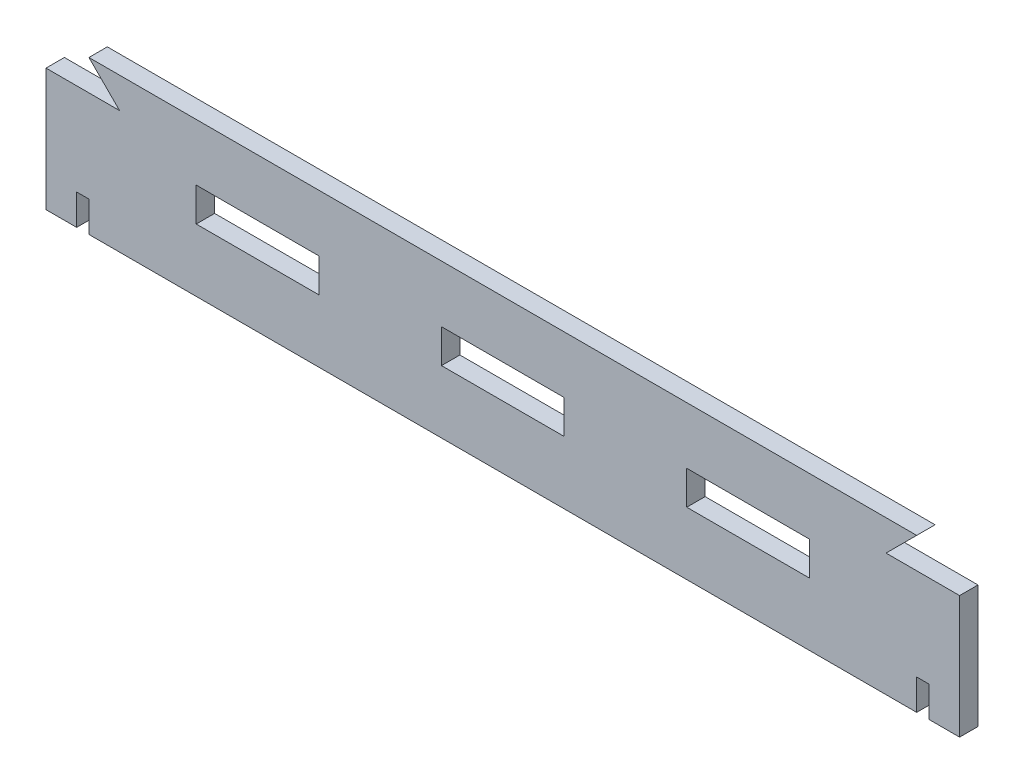
ISO-10303-21;
HEADER;
FILE_DESCRIPTION(('STEP AP214'),'2;1');
FILE_NAME('part.step','',(''),(''),'','','');
FILE_SCHEMA(('AUTOMOTIVE_DESIGN { 1 0 10303 214 1 1 1 1 }'));
ENDSEC;
DATA;
#1=APPLICATION_CONTEXT('core data for automotive mechanical design processes');
#2=APPLICATION_PROTOCOL_DEFINITION('international standard','automotive_design',2000,#1);
#3=PRODUCT_CONTEXT('',#1,'mechanical');
#4=PRODUCT('Part','Part','',(#3));
#5=PRODUCT_RELATED_PRODUCT_CATEGORY('part','',(#4));
#6=PRODUCT_DEFINITION_FORMATION('','',#4);
#7=PRODUCT_DEFINITION_CONTEXT('part definition',#1,'design');
#8=PRODUCT_DEFINITION('design','',#6,#7);
#9=PRODUCT_DEFINITION_SHAPE('','',#8);
#10=(LENGTH_UNIT() NAMED_UNIT(*) SI_UNIT(.MILLI.,.METRE.));
#11=(NAMED_UNIT(*) PLANE_ANGLE_UNIT() SI_UNIT($,.RADIAN.));
#12=(NAMED_UNIT(*) SI_UNIT($,.STERADIAN.) SOLID_ANGLE_UNIT());
#13=UNCERTAINTY_MEASURE_WITH_UNIT(LENGTH_MEASURE(1.E-05),#10,'distance_accuracy_value','');
#14=(GEOMETRIC_REPRESENTATION_CONTEXT(3) GLOBAL_UNCERTAINTY_ASSIGNED_CONTEXT((#13)) GLOBAL_UNIT_ASSIGNED_CONTEXT((#10,
#11,#12)) REPRESENTATION_CONTEXT('',''));
#15=CARTESIAN_POINT('',(0.,0.,0.));
#16=DIRECTION('',(0.,0.,1.));
#17=DIRECTION('',(1.,0.,0.));
#18=AXIS2_PLACEMENT_3D('',#15,#16,#17);
#19=CARTESIAN_POINT('',(61.5,30.,3.));
#20=DIRECTION('',(0.,-1.,0.));
#21=DIRECTION('',(1.,0.,0.));
#22=AXIS2_PLACEMENT_3D('',#19,#20,#21);
#23=PLANE('',#22);
#24=DIRECTION('',(-1.,0.,0.));
#25=VECTOR('',#24,1.);
#26=CARTESIAN_POINT('',(61.5,30.,0.));
#27=LINE('',#26,#25);
#28=CARTESIAN_POINT('',(61.5,30.,0.));
#29=VERTEX_POINT('',#28);
#30=CARTESIAN_POINT('',(-73.5,30.,0.));
#31=VERTEX_POINT('',#30);
#32=EDGE_CURVE('E442',#29,#31,#27,.T.);
#33=ORIENTED_EDGE('',*,*,#32,.T.);
#34=DIRECTION('',(0.,0.,-1.));
#35=VECTOR('',#34,1.);
#36=CARTESIAN_POINT('',(-73.5,30.,3.));
#37=LINE('',#36,#35);
#38=CARTESIAN_POINT('',(-73.5,30.,3.));
#39=VERTEX_POINT('',#38);
#40=EDGE_CURVE('E11',#39,#31,#37,.T.);
#41=ORIENTED_EDGE('',*,*,#40,.F.);
#42=DIRECTION('',(-1.,0.,0.));
#43=VECTOR('',#42,1.);
#44=CARTESIAN_POINT('',(61.5,30.,3.));
#45=LINE('',#44,#43);
#46=CARTESIAN_POINT('',(61.5,30.,3.));
#47=VERTEX_POINT('',#46);
#48=EDGE_CURVE('E452',#47,#39,#45,.T.);
#49=ORIENTED_EDGE('',*,*,#48,.F.);
#50=DIRECTION('',(0.,0.,-1.));
#51=VECTOR('',#50,1.);
#52=CARTESIAN_POINT('',(61.5,30.,3.));
#53=LINE('',#52,#51);
#54=EDGE_CURVE('E485',#47,#29,#53,.T.);
#55=ORIENTED_EDGE('',*,*,#54,.T.);
#56=EDGE_LOOP('',(#33,#41,#49,#55));
#57=FACE_BOUND('',#56,.T.);
#58=ADVANCED_FACE('F45',(#57),#23,.F.);
#59=CARTESIAN_POINT('',(-68.5,25.,3.));
#60=DIRECTION('',(0.707106781186544,0.707106781186551,0.));
#61=DIRECTION('',(-0.707106781186551,0.707106781186544,0.));
#62=AXIS2_PLACEMENT_3D('',#59,#60,#61);
#63=PLANE('',#62);
#64=DIRECTION('',(0.707106781186551,-0.707106781186544,0.));
#65=VECTOR('',#64,1.);
#66=CARTESIAN_POINT('',(-68.5,25.,0.));
#67=LINE('',#66,#65);
#68=CARTESIAN_POINT('',(-68.5,25.,0.));
#69=VERTEX_POINT('',#68);
#70=EDGE_CURVE('E243',#31,#69,#67,.T.);
#71=ORIENTED_EDGE('',*,*,#70,.T.);
#72=DIRECTION('',(0.,0.,-1.));
#73=VECTOR('',#72,1.);
#74=CARTESIAN_POINT('',(-68.5,25.,3.));
#75=LINE('',#74,#73);
#76=CARTESIAN_POINT('',(-68.5,25.,3.));
#77=VERTEX_POINT('',#76);
#78=EDGE_CURVE('E53',#77,#69,#75,.T.);
#79=ORIENTED_EDGE('',*,*,#78,.F.);
#80=DIRECTION('',(0.707106781186551,-0.707106781186544,0.));
#81=VECTOR('',#80,1.);
#82=CARTESIAN_POINT('',(-68.5,25.,3.));
#83=LINE('',#82,#81);
#84=EDGE_CURVE('E456',#39,#77,#83,.T.);
#85=ORIENTED_EDGE('',*,*,#84,.F.);
#86=ORIENTED_EDGE('',*,*,#40,.T.);
#87=EDGE_LOOP('',(#71,#79,#85,#86));
#88=FACE_BOUND('',#87,.T.);
#89=ADVANCED_FACE('F565',(#88),#63,.F.);
#90=CARTESIAN_POINT('',(-78.5,25.,3.));
#91=DIRECTION('',(0.,-1.,0.));
#92=DIRECTION('',(0.,0.,-1.));
#93=AXIS2_PLACEMENT_3D('',#90,#91,#92);
#94=PLANE('',#93);
#95=DIRECTION('',(-1.,0.,0.));
#96=VECTOR('',#95,1.);
#97=CARTESIAN_POINT('',(-78.5,25.,0.));
#98=LINE('',#97,#96);
#99=CARTESIAN_POINT('',(-80.5,25.,0.));
#100=VERTEX_POINT('',#99);
#101=EDGE_CURVE('E232',#69,#100,#98,.T.);
#102=ORIENTED_EDGE('',*,*,#101,.T.);
#103=DIRECTION('',(0.,0.,1.));
#104=VECTOR('',#103,1.);
#105=CARTESIAN_POINT('',(-80.5,25.,0.));
#106=LINE('',#105,#104);
#107=CARTESIAN_POINT('',(-80.5,25.,3.));
#108=VERTEX_POINT('',#107);
#109=EDGE_CURVE('E236',#100,#108,#106,.T.);
#110=ORIENTED_EDGE('',*,*,#109,.T.);
#111=DIRECTION('',(-1.,0.,0.));
#112=VECTOR('',#111,1.);
#113=CARTESIAN_POINT('',(-78.5,25.,3.));
#114=LINE('',#113,#112);
#115=EDGE_CURVE('E460',#77,#108,#114,.T.);
#116=ORIENTED_EDGE('',*,*,#115,.F.);
#117=ORIENTED_EDGE('',*,*,#78,.T.);
#118=EDGE_LOOP('',(#102,#110,#116,#117));
#119=FACE_BOUND('',#118,.T.);
#120=ADVANCED_FACE('F234',(#119),#94,.F.);
#121=CARTESIAN_POINT('',(-78.5,10.,3.));
#122=DIRECTION('',(0.,1.,0.));
#123=DIRECTION('',(0.,0.,1.));
#124=AXIS2_PLACEMENT_3D('',#121,#122,#123);
#125=PLANE('',#124);
#126=DIRECTION('',(1.,0.,0.));
#127=VECTOR('',#126,1.);
#128=CARTESIAN_POINT('',(-78.5,10.,3.));
#129=LINE('',#128,#127);
#130=CARTESIAN_POINT('',(-75.5,10.,3.));
#131=VERTEX_POINT('',#130);
#132=CARTESIAN_POINT('',(-73.5,10.,3.));
#133=VERTEX_POINT('',#132);
#134=EDGE_CURVE('E463',#131,#133,#129,.T.);
#135=ORIENTED_EDGE('',*,*,#134,.F.);
#136=DIRECTION('',(0.,0.,-1.));
#137=VECTOR('',#136,1.);
#138=CARTESIAN_POINT('',(-75.5,10.,3.));
#139=LINE('',#138,#137);
#140=CARTESIAN_POINT('',(-75.5,10.,0.));
#141=VERTEX_POINT('',#140);
#142=EDGE_CURVE('E317',#131,#141,#139,.T.);
#143=ORIENTED_EDGE('',*,*,#142,.T.);
#144=DIRECTION('',(1.,0.,0.));
#145=VECTOR('',#144,1.);
#146=CARTESIAN_POINT('',(-78.5,10.,0.));
#147=LINE('',#146,#145);
#148=CARTESIAN_POINT('',(-73.5,10.,0.));
#149=VERTEX_POINT('',#148);
#150=EDGE_CURVE('E242',#141,#149,#147,.T.);
#151=ORIENTED_EDGE('',*,*,#150,.T.);
#152=DIRECTION('',(0.,0.,-1.));
#153=VECTOR('',#152,1.);
#154=CARTESIAN_POINT('',(-73.5,10.,3.));
#155=LINE('',#154,#153);
#156=EDGE_CURVE('E530',#133,#149,#155,.T.);
#157=ORIENTED_EDGE('',*,*,#156,.F.);
#158=EDGE_LOOP('',(#135,#143,#151,#157));
#159=FACE_BOUND('',#158,.T.);
#160=ADVANCED_FACE('F556',(#159),#125,.F.);
#161=CARTESIAN_POINT('',(-73.5,10.,3.));
#162=DIRECTION('',(1.,0.,0.));
#163=DIRECTION('',(0.,0.,-1.));
#164=AXIS2_PLACEMENT_3D('',#161,#162,#163);
#165=PLANE('',#164);
#166=DIRECTION('',(0.,-1.,0.));
#167=VECTOR('',#166,1.);
#168=CARTESIAN_POINT('',(-73.5,10.,0.));
#169=LINE('',#168,#167);
#170=CARTESIAN_POINT('',(-73.5,5.,0.));
#171=VERTEX_POINT('',#170);
#172=EDGE_CURVE('E493',#149,#171,#169,.T.);
#173=ORIENTED_EDGE('',*,*,#172,.T.);
#174=DIRECTION('',(0.,0.,-1.));
#175=VECTOR('',#174,1.);
#176=CARTESIAN_POINT('',(-73.5,5.,3.));
#177=LINE('',#176,#175);
#178=CARTESIAN_POINT('',(-73.5,5.,3.));
#179=VERTEX_POINT('',#178);
#180=EDGE_CURVE('E526',#179,#171,#177,.T.);
#181=ORIENTED_EDGE('',*,*,#180,.F.);
#182=DIRECTION('',(0.,-1.,0.));
#183=VECTOR('',#182,1.);
#184=CARTESIAN_POINT('',(-73.5,10.,3.));
#185=LINE('',#184,#183);
#186=EDGE_CURVE('E466',#133,#179,#185,.T.);
#187=ORIENTED_EDGE('',*,*,#186,.F.);
#188=ORIENTED_EDGE('',*,*,#156,.T.);
#189=EDGE_LOOP('',(#173,#181,#187,#188));
#190=FACE_BOUND('',#189,.T.);
#191=ADVANCED_FACE('F538',(#190),#165,.F.);
#192=CARTESIAN_POINT('',(-73.5,5.,3.));
#193=DIRECTION('',(0.,1.,0.));
#194=DIRECTION('',(0.,0.,1.));
#195=AXIS2_PLACEMENT_3D('',#192,#193,#194);
#196=PLANE('',#195);
#197=DIRECTION('',(1.,0.,0.));
#198=VECTOR('',#197,1.);
#199=CARTESIAN_POINT('',(-73.5,5.,0.));
#200=LINE('',#199,#198);
#201=CARTESIAN_POINT('',(61.5,5.,0.));
#202=VERTEX_POINT('',#201);
#203=EDGE_CURVE('E496',#171,#202,#200,.T.);
#204=ORIENTED_EDGE('',*,*,#203,.T.);
#205=DIRECTION('',(0.,0.,-1.));
#206=VECTOR('',#205,1.);
#207=CARTESIAN_POINT('',(61.5,5.,3.));
#208=LINE('',#207,#206);
#209=CARTESIAN_POINT('',(61.5,5.,3.));
#210=VERTEX_POINT('',#209);
#211=EDGE_CURVE('E522',#210,#202,#208,.T.);
#212=ORIENTED_EDGE('',*,*,#211,.F.);
#213=DIRECTION('',(1.,0.,0.));
#214=VECTOR('',#213,1.);
#215=CARTESIAN_POINT('',(-73.5,5.,3.));
#216=LINE('',#215,#214);
#217=EDGE_CURVE('E469',#179,#210,#216,.T.);
#218=ORIENTED_EDGE('',*,*,#217,.F.);
#219=ORIENTED_EDGE('',*,*,#180,.T.);
#220=EDGE_LOOP('',(#204,#212,#218,#219));
#221=FACE_BOUND('',#220,.T.);
#222=ADVANCED_FACE('F547',(#221),#196,.F.);
#223=CARTESIAN_POINT('',(61.5,5.,3.));
#224=DIRECTION('',(-1.,0.,0.));
#225=DIRECTION('',(0.,0.,1.));
#226=AXIS2_PLACEMENT_3D('',#223,#224,#225);
#227=PLANE('',#226);
#228=DIRECTION('',(0.,1.,0.));
#229=VECTOR('',#228,1.);
#230=CARTESIAN_POINT('',(61.5,5.,0.));
#231=LINE('',#230,#229);
#232=CARTESIAN_POINT('',(61.5,10.,0.));
#233=VERTEX_POINT('',#232);
#234=EDGE_CURVE('E499',#202,#233,#231,.T.);
#235=ORIENTED_EDGE('',*,*,#234,.T.);
#236=DIRECTION('',(0.,0.,-1.));
#237=VECTOR('',#236,1.);
#238=CARTESIAN_POINT('',(61.5,10.,3.));
#239=LINE('',#238,#237);
#240=CARTESIAN_POINT('',(61.5,10.,3.));
#241=VERTEX_POINT('',#240);
#242=EDGE_CURVE('E518',#241,#233,#239,.T.);
#243=ORIENTED_EDGE('',*,*,#242,.F.);
#244=DIRECTION('',(0.,1.,0.));
#245=VECTOR('',#244,1.);
#246=CARTESIAN_POINT('',(61.5,5.,3.));
#247=LINE('',#246,#245);
#248=EDGE_CURVE('E472',#210,#241,#247,.T.);
#249=ORIENTED_EDGE('',*,*,#248,.F.);
#250=ORIENTED_EDGE('',*,*,#211,.T.);
#251=EDGE_LOOP('',(#235,#243,#249,#250));
#252=FACE_BOUND('',#251,.T.);
#253=ADVANCED_FACE('F551',(#252),#227,.F.);
#254=CARTESIAN_POINT('',(61.5,10.,3.));
#255=DIRECTION('',(0.,1.,0.));
#256=DIRECTION('',(0.,0.,1.));
#257=AXIS2_PLACEMENT_3D('',#254,#255,#256);
#258=PLANE('',#257);
#259=DIRECTION('',(1.,0.,0.));
#260=VECTOR('',#259,1.);
#261=CARTESIAN_POINT('',(61.5,10.,0.));
#262=LINE('',#261,#260);
#263=CARTESIAN_POINT('',(63.5,10.,0.));
#264=VERTEX_POINT('',#263);
#265=EDGE_CURVE('E502',#233,#264,#262,.T.);
#266=ORIENTED_EDGE('',*,*,#265,.T.);
#267=DIRECTION('',(0.,0.,1.));
#268=VECTOR('',#267,1.);
#269=CARTESIAN_POINT('',(63.5,10.,3.));
#270=LINE('',#269,#268);
#271=CARTESIAN_POINT('',(63.5,10.,3.));
#272=VERTEX_POINT('',#271);
#273=EDGE_CURVE('E279',#264,#272,#270,.T.);
#274=ORIENTED_EDGE('',*,*,#273,.T.);
#275=DIRECTION('',(1.,0.,0.));
#276=VECTOR('',#275,1.);
#277=CARTESIAN_POINT('',(61.5,10.,3.));
#278=LINE('',#277,#276);
#279=EDGE_CURVE('E475',#241,#272,#278,.T.);
#280=ORIENTED_EDGE('',*,*,#279,.F.);
#281=ORIENTED_EDGE('',*,*,#242,.T.);
#282=EDGE_LOOP('',(#266,#274,#280,#281));
#283=FACE_BOUND('',#282,.T.);
#284=ADVANCED_FACE('F589',(#283),#258,.F.);
#285=CARTESIAN_POINT('',(56.5,25.,3.));
#286=DIRECTION('',(0.,-1.,0.));
#287=DIRECTION('',(0.,0.,-1.));
#288=AXIS2_PLACEMENT_3D('',#285,#286,#287);
#289=PLANE('',#288);
#290=DIRECTION('',(0.,0.,-1.));
#291=VECTOR('',#290,1.);
#292=CARTESIAN_POINT('',(56.5,25.,3.));
#293=LINE('',#292,#291);
#294=CARTESIAN_POINT('',(56.5,25.,3.));
#295=VERTEX_POINT('',#294);
#296=CARTESIAN_POINT('',(56.5,25.,0.));
#297=VERTEX_POINT('',#296);
#298=EDGE_CURVE('E514',#295,#297,#293,.T.);
#299=ORIENTED_EDGE('',*,*,#298,.F.);
#300=DIRECTION('',(-1.,0.,0.));
#301=VECTOR('',#300,1.);
#302=CARTESIAN_POINT('',(56.5,25.,3.));
#303=LINE('',#302,#301);
#304=CARTESIAN_POINT('',(68.5,25.,3.));
#305=VERTEX_POINT('',#304);
#306=EDGE_CURVE('E479',#305,#295,#303,.T.);
#307=ORIENTED_EDGE('',*,*,#306,.F.);
#308=DIRECTION('',(0.,0.,1.));
#309=VECTOR('',#308,1.);
#310=CARTESIAN_POINT('',(68.5,25.,0.));
#311=LINE('',#310,#309);
#312=CARTESIAN_POINT('',(68.5,25.,0.));
#313=VERTEX_POINT('',#312);
#314=EDGE_CURVE('E290',#313,#305,#311,.T.);
#315=ORIENTED_EDGE('',*,*,#314,.F.);
#316=DIRECTION('',(-1.,0.,0.));
#317=VECTOR('',#316,1.);
#318=CARTESIAN_POINT('',(56.5,25.,0.));
#319=LINE('',#318,#317);
#320=EDGE_CURVE('E506',#313,#297,#319,.T.);
#321=ORIENTED_EDGE('',*,*,#320,.T.);
#322=EDGE_LOOP('',(#299,#307,#315,#321));
#323=FACE_BOUND('',#322,.T.);
#324=ADVANCED_FACE('F575',(#323),#289,.F.);
#325=CARTESIAN_POINT('',(56.5,25.,3.));
#326=DIRECTION('',(-0.707106781186551,0.707106781186544,0.));
#327=DIRECTION('',(-0.707106781186544,-0.707106781186551,0.));
#328=AXIS2_PLACEMENT_3D('',#325,#326,#327);
#329=PLANE('',#328);
#330=DIRECTION('',(0.707106781186544,0.707106781186551,0.));
#331=VECTOR('',#330,1.);
#332=CARTESIAN_POINT('',(56.5,25.,0.));
#333=LINE('',#332,#331);
#334=EDGE_CURVE('E457',#297,#29,#333,.T.);
#335=ORIENTED_EDGE('',*,*,#334,.T.);
#336=ORIENTED_EDGE('',*,*,#54,.F.);
#337=DIRECTION('',(0.707106781186544,0.707106781186551,0.));
#338=VECTOR('',#337,1.);
#339=CARTESIAN_POINT('',(56.5,25.,3.));
#340=LINE('',#339,#338);
#341=EDGE_CURVE('E482',#295,#47,#340,.T.);
#342=ORIENTED_EDGE('',*,*,#341,.F.);
#343=ORIENTED_EDGE('',*,*,#298,.T.);
#344=EDGE_LOOP('',(#335,#336,#342,#343));
#345=FACE_BOUND('',#344,.T.);
#346=ADVANCED_FACE('F572',(#345),#329,.F.);
#347=CARTESIAN_POINT('',(0.,0.,3.));
#348=DIRECTION('',(0.,0.,1.));
#349=DIRECTION('',(1.,0.,0.));
#350=AXIS2_PLACEMENT_3D('',#347,#348,#349);
#351=PLANE('',#350);
#352=ORIENTED_EDGE('',*,*,#115,.T.);
#353=DIRECTION('',(0.,-1.,0.));
#354=VECTOR('',#353,1.);
#355=CARTESIAN_POINT('',(-80.5,25.,3.));
#356=LINE('',#355,#354);
#357=CARTESIAN_POINT('',(-80.5,5.,3.));
#358=VERTEX_POINT('',#357);
#359=EDGE_CURVE('E251',#108,#358,#356,.T.);
#360=ORIENTED_EDGE('',*,*,#359,.T.);
#361=DIRECTION('',(1.,0.,0.));
#362=VECTOR('',#361,1.);
#363=CARTESIAN_POINT('',(-75.5,5.,3.));
#364=LINE('',#363,#362);
#365=CARTESIAN_POINT('',(-75.5,5.,3.));
#366=VERTEX_POINT('',#365);
#367=EDGE_CURVE('E266',#358,#366,#364,.T.);
#368=ORIENTED_EDGE('',*,*,#367,.T.);
#369=DIRECTION('',(0.,1.,0.));
#370=VECTOR('',#369,1.);
#371=CARTESIAN_POINT('',(-75.5,25.,3.));
#372=LINE('',#371,#370);
#373=EDGE_CURVE('E60',#366,#131,#372,.T.);
#374=ORIENTED_EDGE('',*,*,#373,.T.);
#375=ORIENTED_EDGE('',*,*,#134,.T.);
#376=ORIENTED_EDGE('',*,*,#186,.T.);
#377=ORIENTED_EDGE('',*,*,#217,.T.);
#378=ORIENTED_EDGE('',*,*,#248,.T.);
#379=ORIENTED_EDGE('',*,*,#279,.T.);
#380=DIRECTION('',(0.,-1.,0.));
#381=VECTOR('',#380,1.);
#382=CARTESIAN_POINT('',(63.5,25.,3.));
#383=LINE('',#382,#381);
#384=CARTESIAN_POINT('',(63.5,5.,3.));
#385=VERTEX_POINT('',#384);
#386=EDGE_CURVE('E271',#272,#385,#383,.T.);
#387=ORIENTED_EDGE('',*,*,#386,.T.);
#388=DIRECTION('',(1.,0.,0.));
#389=VECTOR('',#388,1.);
#390=CARTESIAN_POINT('',(63.5,5.,3.));
#391=LINE('',#390,#389);
#392=CARTESIAN_POINT('',(68.5,5.,3.));
#393=VERTEX_POINT('',#392);
#394=EDGE_CURVE('E298',#385,#393,#391,.T.);
#395=ORIENTED_EDGE('',*,*,#394,.T.);
#396=DIRECTION('',(0.,1.,0.));
#397=VECTOR('',#396,1.);
#398=CARTESIAN_POINT('',(68.5,25.,3.));
#399=LINE('',#398,#397);
#400=EDGE_CURVE('E294',#393,#305,#399,.T.);
#401=ORIENTED_EDGE('',*,*,#400,.T.);
#402=ORIENTED_EDGE('',*,*,#306,.T.);
#403=ORIENTED_EDGE('',*,*,#341,.T.);
#404=ORIENTED_EDGE('',*,*,#48,.T.);
#405=ORIENTED_EDGE('',*,*,#84,.T.);
#406=EDGE_LOOP('',(#352,#360,#368,#374,#375,#376,#377,#378,#379,#387,#395,#401,#402,#403,#404,#405));
#407=FACE_BOUND('',#406,.T.);
#408=DIRECTION('',(0.,-1.,0.));
#409=VECTOR('',#408,1.);
#410=CARTESIAN_POINT('',(24.,20.725640354706,3.));
#411=LINE('',#410,#409);
#412=CARTESIAN_POINT('',(24.,20.725640354706,3.));
#413=VERTEX_POINT('',#412);
#414=CARTESIAN_POINT('',(24.,15.225640354706,3.));
#415=VERTEX_POINT('',#414);
#416=EDGE_CURVE('E68',#413,#415,#411,.T.);
#417=ORIENTED_EDGE('',*,*,#416,.F.);
#418=DIRECTION('',(-1.,0.,0.));
#419=VECTOR('',#418,1.);
#420=CARTESIAN_POINT('',(24.,20.725640354706,3.));
#421=LINE('',#420,#419);
#422=CARTESIAN_POINT('',(44.,20.725640354706,3.));
#423=VERTEX_POINT('',#422);
#424=EDGE_CURVE('E379',#423,#413,#421,.T.);
#425=ORIENTED_EDGE('',*,*,#424,.F.);
#426=DIRECTION('',(0.,1.,0.));
#427=VECTOR('',#426,1.);
#428=CARTESIAN_POINT('',(44.,20.725640354706,3.));
#429=LINE('',#428,#427);
#430=CARTESIAN_POINT('',(44.,15.225640354706,3.));
#431=VERTEX_POINT('',#430);
#432=EDGE_CURVE('E383',#431,#423,#429,.T.);
#433=ORIENTED_EDGE('',*,*,#432,.F.);
#434=DIRECTION('',(1.,0.,0.));
#435=VECTOR('',#434,1.);
#436=CARTESIAN_POINT('',(24.,15.225640354706,3.));
#437=LINE('',#436,#435);
#438=EDGE_CURVE('E388',#415,#431,#437,.T.);
#439=ORIENTED_EDGE('',*,*,#438,.F.);
#440=EDGE_LOOP('',(#417,#425,#433,#439));
#441=FACE_BOUND('',#440,.T.);
#442=DIRECTION('',(0.,-1.,0.));
#443=VECTOR('',#442,1.);
#444=CARTESIAN_POINT('',(-56.,15.225640354706,3.));
#445=LINE('',#444,#443);
#446=CARTESIAN_POINT('',(-56.,20.725640354706,3.));
#447=VERTEX_POINT('',#446);
#448=CARTESIAN_POINT('',(-56.,15.225640354706,3.));
#449=VERTEX_POINT('',#448);
#450=EDGE_CURVE('E349',#447,#449,#445,.T.);
#451=ORIENTED_EDGE('',*,*,#450,.F.);
#452=DIRECTION('',(-1.,0.,0.));
#453=VECTOR('',#452,1.);
#454=CARTESIAN_POINT('',(-56.,20.725640354706,3.));
#455=LINE('',#454,#453);
#456=CARTESIAN_POINT('',(-36.,20.725640354706,3.));
#457=VERTEX_POINT('',#456);
#458=EDGE_CURVE('E336',#457,#447,#455,.T.);
#459=ORIENTED_EDGE('',*,*,#458,.F.);
#460=DIRECTION('',(0.,1.,0.));
#461=VECTOR('',#460,1.);
#462=CARTESIAN_POINT('',(-36.,15.225640354706,3.));
#463=LINE('',#462,#461);
#464=CARTESIAN_POINT('',(-36.,15.225640354706,3.));
#465=VERTEX_POINT('',#464);
#466=EDGE_CURVE('E340',#465,#457,#463,.T.);
#467=ORIENTED_EDGE('',*,*,#466,.F.);
#468=DIRECTION('',(1.,0.,0.));
#469=VECTOR('',#468,1.);
#470=CARTESIAN_POINT('',(-56.,15.225640354706,3.));
#471=LINE('',#470,#469);
#472=EDGE_CURVE('E345',#449,#465,#471,.T.);
#473=ORIENTED_EDGE('',*,*,#472,.F.);
#474=EDGE_LOOP('',(#451,#459,#467,#473));
#475=FACE_BOUND('',#474,.T.);
#476=DIRECTION('',(0.,1.,0.));
#477=VECTOR('',#476,1.);
#478=CARTESIAN_POINT('',(3.99999999999998,15.225640354706,3.));
#479=LINE('',#478,#477);
#480=CARTESIAN_POINT('',(3.99999999999998,15.225640354706,3.));
#481=VERTEX_POINT('',#480);
#482=CARTESIAN_POINT('',(3.99999999999998,20.725640354706,3.));
#483=VERTEX_POINT('',#482);
#484=EDGE_CURVE('E352',#481,#483,#479,.T.);
#485=ORIENTED_EDGE('',*,*,#484,.F.);
#486=DIRECTION('',(1.,0.,0.));
#487=VECTOR('',#486,1.);
#488=CARTESIAN_POINT('',(-16.,15.225640354706,3.));
#489=LINE('',#488,#487);
#490=CARTESIAN_POINT('',(-16.,15.225640354706,3.));
#491=VERTEX_POINT('',#490);
#492=EDGE_CURVE('E413',#491,#481,#489,.T.);
#493=ORIENTED_EDGE('',*,*,#492,.F.);
#494=DIRECTION('',(0.,-1.,0.));
#495=VECTOR('',#494,1.);
#496=CARTESIAN_POINT('',(-16.,15.225640354706,3.));
#497=LINE('',#496,#495);
#498=CARTESIAN_POINT('',(-16.,20.725640354706,3.));
#499=VERTEX_POINT('',#498);
#500=EDGE_CURVE('E432',#499,#491,#497,.T.);
#501=ORIENTED_EDGE('',*,*,#500,.F.);
#502=DIRECTION('',(-1.,0.,0.));
#503=VECTOR('',#502,1.);
#504=CARTESIAN_POINT('',(-16.,20.725640354706,3.));
#505=LINE('',#504,#503);
#506=EDGE_CURVE('E428',#483,#499,#505,.T.);
#507=ORIENTED_EDGE('',*,*,#506,.F.);
#508=EDGE_LOOP('',(#485,#493,#501,#507));
#509=FACE_BOUND('',#508,.T.);
#510=ADVANCED_FACE('F554',(#407,#441,#475,#509),#351,.T.);
#511=CARTESIAN_POINT('',(0.,0.,0.));
#512=DIRECTION('',(0.,0.,1.));
#513=DIRECTION('',(1.,0.,0.));
#514=AXIS2_PLACEMENT_3D('',#511,#512,#513);
#515=PLANE('',#514);
#516=DIRECTION('',(-1.,0.,0.));
#517=VECTOR('',#516,1.);
#518=CARTESIAN_POINT('',(24.,20.725640354706,0.));
#519=LINE('',#518,#517);
#520=CARTESIAN_POINT('',(44.,20.725640354706,0.));
#521=VERTEX_POINT('',#520);
#522=CARTESIAN_POINT('',(24.,20.725640354706,0.));
#523=VERTEX_POINT('',#522);
#524=EDGE_CURVE('E370',#521,#523,#519,.T.);
#525=ORIENTED_EDGE('',*,*,#524,.T.);
#526=DIRECTION('',(0.,-1.,0.));
#527=VECTOR('',#526,1.);
#528=CARTESIAN_POINT('',(24.,20.725640354706,0.));
#529=LINE('',#528,#527);
#530=CARTESIAN_POINT('',(24.,15.225640354706,0.));
#531=VERTEX_POINT('',#530);
#532=EDGE_CURVE('E384',#523,#531,#529,.T.);
#533=ORIENTED_EDGE('',*,*,#532,.T.);
#534=DIRECTION('',(1.,0.,0.));
#535=VECTOR('',#534,1.);
#536=CARTESIAN_POINT('',(24.,15.225640354706,0.));
#537=LINE('',#536,#535);
#538=CARTESIAN_POINT('',(44.,15.225640354706,0.));
#539=VERTEX_POINT('',#538);
#540=EDGE_CURVE('E401',#531,#539,#537,.T.);
#541=ORIENTED_EDGE('',*,*,#540,.T.);
#542=DIRECTION('',(0.,1.,0.));
#543=VECTOR('',#542,1.);
#544=CARTESIAN_POINT('',(44.,20.725640354706,0.));
#545=LINE('',#544,#543);
#546=EDGE_CURVE('E397',#539,#521,#545,.T.);
#547=ORIENTED_EDGE('',*,*,#546,.T.);
#548=EDGE_LOOP('',(#525,#533,#541,#547));
#549=FACE_BOUND('',#548,.T.);
#550=DIRECTION('',(-1.,0.,0.));
#551=VECTOR('',#550,1.);
#552=CARTESIAN_POINT('',(-56.,20.725640354706,0.));
#553=LINE('',#552,#551);
#554=CARTESIAN_POINT('',(-36.,20.725640354706,0.));
#555=VERTEX_POINT('',#554);
#556=CARTESIAN_POINT('',(-56.,20.725640354706,0.));
#557=VERTEX_POINT('',#556);
#558=EDGE_CURVE('E326',#555,#557,#553,.T.);
#559=ORIENTED_EDGE('',*,*,#558,.T.);
#560=DIRECTION('',(0.,-1.,0.));
#561=VECTOR('',#560,1.);
#562=CARTESIAN_POINT('',(-56.,15.225640354706,0.));
#563=LINE('',#562,#561);
#564=CARTESIAN_POINT('',(-56.,15.225640354706,0.));
#565=VERTEX_POINT('',#564);
#566=EDGE_CURVE('E341',#557,#565,#563,.T.);
#567=ORIENTED_EDGE('',*,*,#566,.T.);
#568=DIRECTION('',(1.,0.,0.));
#569=VECTOR('',#568,1.);
#570=CARTESIAN_POINT('',(-56.,15.225640354706,0.));
#571=LINE('',#570,#569);
#572=CARTESIAN_POINT('',(-36.,15.225640354706,0.));
#573=VERTEX_POINT('',#572);
#574=EDGE_CURVE('E360',#565,#573,#571,.T.);
#575=ORIENTED_EDGE('',*,*,#574,.T.);
#576=DIRECTION('',(0.,1.,0.));
#577=VECTOR('',#576,1.);
#578=CARTESIAN_POINT('',(-36.,15.225640354706,0.));
#579=LINE('',#578,#577);
#580=EDGE_CURVE('E356',#573,#555,#579,.T.);
#581=ORIENTED_EDGE('',*,*,#580,.T.);
#582=EDGE_LOOP('',(#559,#567,#575,#581));
#583=FACE_BOUND('',#582,.T.);
#584=DIRECTION('',(1.,0.,0.));
#585=VECTOR('',#584,1.);
#586=CARTESIAN_POINT('',(-16.,15.225640354706,0.));
#587=LINE('',#586,#585);
#588=CARTESIAN_POINT('',(-16.,15.225640354706,0.));
#589=VERTEX_POINT('',#588);
#590=CARTESIAN_POINT('',(3.99999999999998,15.225640354706,0.));
#591=VERTEX_POINT('',#590);
#592=EDGE_CURVE('E421',#589,#591,#587,.T.);
#593=ORIENTED_EDGE('',*,*,#592,.T.);
#594=DIRECTION('',(0.,1.,0.));
#595=VECTOR('',#594,1.);
#596=CARTESIAN_POINT('',(3.99999999999998,15.225640354706,0.));
#597=LINE('',#596,#595);
#598=CARTESIAN_POINT('',(3.99999999999998,20.725640354706,0.));
#599=VERTEX_POINT('',#598);
#600=EDGE_CURVE('E408',#591,#599,#597,.T.);
#601=ORIENTED_EDGE('',*,*,#600,.T.);
#602=DIRECTION('',(-1.,0.,0.));
#603=VECTOR('',#602,1.);
#604=CARTESIAN_POINT('',(-16.,20.725640354706,0.));
#605=LINE('',#604,#603);
#606=CARTESIAN_POINT('',(-16.,20.725640354706,0.));
#607=VERTEX_POINT('',#606);
#608=EDGE_CURVE('E412',#599,#607,#605,.T.);
#609=ORIENTED_EDGE('',*,*,#608,.T.);
#610=DIRECTION('',(0.,-1.,0.));
#611=VECTOR('',#610,1.);
#612=CARTESIAN_POINT('',(-16.,15.225640354706,0.));
#613=LINE('',#612,#611);
#614=EDGE_CURVE('E417',#607,#589,#613,.T.);
#615=ORIENTED_EDGE('',*,*,#614,.T.);
#616=EDGE_LOOP('',(#593,#601,#609,#615));
#617=FACE_BOUND('',#616,.T.);
#618=ORIENTED_EDGE('',*,*,#150,.F.);
#619=DIRECTION('',(0.,1.,0.));
#620=VECTOR('',#619,1.);
#621=CARTESIAN_POINT('',(-75.5,25.,0.));
#622=LINE('',#621,#620);
#623=CARTESIAN_POINT('',(-75.5,5.,0.));
#624=VERTEX_POINT('',#623);
#625=EDGE_CURVE('E261',#624,#141,#622,.T.);
#626=ORIENTED_EDGE('',*,*,#625,.F.);
#627=DIRECTION('',(1.,0.,0.));
#628=VECTOR('',#627,1.);
#629=CARTESIAN_POINT('',(-75.5,5.,0.));
#630=LINE('',#629,#628);
#631=CARTESIAN_POINT('',(-80.5,5.,0.));
#632=VERTEX_POINT('',#631);
#633=EDGE_CURVE('E254',#632,#624,#630,.T.);
#634=ORIENTED_EDGE('',*,*,#633,.F.);
#635=DIRECTION('',(0.,-1.,0.));
#636=VECTOR('',#635,1.);
#637=CARTESIAN_POINT('',(-80.5,25.,0.));
#638=LINE('',#637,#636);
#639=EDGE_CURVE('E248',#100,#632,#638,.T.);
#640=ORIENTED_EDGE('',*,*,#639,.F.);
#641=ORIENTED_EDGE('',*,*,#101,.F.);
#642=ORIENTED_EDGE('',*,*,#70,.F.);
#643=ORIENTED_EDGE('',*,*,#32,.F.);
#644=ORIENTED_EDGE('',*,*,#334,.F.);
#645=ORIENTED_EDGE('',*,*,#320,.F.);
#646=DIRECTION('',(0.,1.,0.));
#647=VECTOR('',#646,1.);
#648=CARTESIAN_POINT('',(68.5,25.,0.));
#649=LINE('',#648,#647);
#650=CARTESIAN_POINT('',(68.5,5.,0.));
#651=VERTEX_POINT('',#650);
#652=EDGE_CURVE('E286',#651,#313,#649,.T.);
#653=ORIENTED_EDGE('',*,*,#652,.F.);
#654=DIRECTION('',(1.,0.,0.));
#655=VECTOR('',#654,1.);
#656=CARTESIAN_POINT('',(63.5,5.,0.));
#657=LINE('',#656,#655);
#658=CARTESIAN_POINT('',(63.5,5.,0.));
#659=VERTEX_POINT('',#658);
#660=EDGE_CURVE('E308',#659,#651,#657,.T.);
#661=ORIENTED_EDGE('',*,*,#660,.F.);
#662=DIRECTION('',(0.,-1.,0.));
#663=VECTOR('',#662,1.);
#664=CARTESIAN_POINT('',(63.5,25.,0.));
#665=LINE('',#664,#663);
#666=EDGE_CURVE('E299',#264,#659,#665,.T.);
#667=ORIENTED_EDGE('',*,*,#666,.F.);
#668=ORIENTED_EDGE('',*,*,#265,.F.);
#669=ORIENTED_EDGE('',*,*,#234,.F.);
#670=ORIENTED_EDGE('',*,*,#203,.F.);
#671=ORIENTED_EDGE('',*,*,#172,.F.);
#672=EDGE_LOOP('',(#618,#626,#634,#640,#641,#642,#643,#644,#645,#653,#661,#667,#668,#669,#670,#671));
#673=FACE_BOUND('',#672,.T.);
#674=ADVANCED_FACE('F257',(#549,#583,#617,#673),#515,.F.);
#675=CARTESIAN_POINT('',(3.99999999999998,15.225640354706,0.));
#676=DIRECTION('',(1.,0.,0.));
#677=DIRECTION('',(0.,1.,0.));
#678=AXIS2_PLACEMENT_3D('',#675,#676,#677);
#679=PLANE('',#678);
#680=ORIENTED_EDGE('',*,*,#484,.T.);
#681=DIRECTION('',(0.,0.,1.));
#682=VECTOR('',#681,1.);
#683=CARTESIAN_POINT('',(3.99999999999998,20.725640354706,0.));
#684=LINE('',#683,#682);
#685=EDGE_CURVE('E425',#599,#483,#684,.T.);
#686=ORIENTED_EDGE('',*,*,#685,.F.);
#687=ORIENTED_EDGE('',*,*,#600,.F.);
#688=DIRECTION('',(0.,0.,1.));
#689=VECTOR('',#688,1.);
#690=CARTESIAN_POINT('',(3.99999999999998,15.225640354706,0.));
#691=LINE('',#690,#689);
#692=EDGE_CURVE('E439',#591,#481,#691,.T.);
#693=ORIENTED_EDGE('',*,*,#692,.T.);
#694=EDGE_LOOP('',(#680,#686,#687,#693));
#695=FACE_BOUND('',#694,.T.);
#696=ADVANCED_FACE('F634',(#695),#679,.F.);
#697=CARTESIAN_POINT('',(-16.,15.225640354706,0.));
#698=DIRECTION('',(0.,-1.,0.));
#699=DIRECTION('',(0.,0.,-1.));
#700=AXIS2_PLACEMENT_3D('',#697,#698,#699);
#701=PLANE('',#700);
#702=ORIENTED_EDGE('',*,*,#492,.T.);
#703=ORIENTED_EDGE('',*,*,#692,.F.);
#704=ORIENTED_EDGE('',*,*,#592,.F.);
#705=DIRECTION('',(0.,0.,1.));
#706=VECTOR('',#705,1.);
#707=CARTESIAN_POINT('',(-16.,15.225640354706,0.));
#708=LINE('',#707,#706);
#709=EDGE_CURVE('E443',#589,#491,#708,.T.);
#710=ORIENTED_EDGE('',*,*,#709,.T.);
#711=EDGE_LOOP('',(#702,#703,#704,#710));
#712=FACE_BOUND('',#711,.T.);
#713=ADVANCED_FACE('F638',(#712),#701,.F.);
#714=CARTESIAN_POINT('',(-16.,15.225640354706,0.));
#715=DIRECTION('',(-1.,0.,0.));
#716=DIRECTION('',(0.,0.,1.));
#717=AXIS2_PLACEMENT_3D('',#714,#715,#716);
#718=PLANE('',#717);
#719=ORIENTED_EDGE('',*,*,#500,.T.);
#720=ORIENTED_EDGE('',*,*,#709,.F.);
#721=ORIENTED_EDGE('',*,*,#614,.F.);
#722=DIRECTION('',(0.,0.,1.));
#723=VECTOR('',#722,1.);
#724=CARTESIAN_POINT('',(-16.,20.725640354706,0.));
#725=LINE('',#724,#723);
#726=EDGE_CURVE('E446',#607,#499,#725,.T.);
#727=ORIENTED_EDGE('',*,*,#726,.T.);
#728=EDGE_LOOP('',(#719,#720,#721,#727));
#729=FACE_BOUND('',#728,.T.);
#730=ADVANCED_FACE('F648',(#729),#718,.F.);
#731=CARTESIAN_POINT('',(-16.,20.725640354706,0.));
#732=DIRECTION('',(0.,1.,0.));
#733=DIRECTION('',(0.,0.,1.));
#734=AXIS2_PLACEMENT_3D('',#731,#732,#733);
#735=PLANE('',#734);
#736=ORIENTED_EDGE('',*,*,#506,.T.);
#737=ORIENTED_EDGE('',*,*,#726,.F.);
#738=ORIENTED_EDGE('',*,*,#608,.F.);
#739=ORIENTED_EDGE('',*,*,#685,.T.);
#740=EDGE_LOOP('',(#736,#737,#738,#739));
#741=FACE_BOUND('',#740,.T.);
#742=ADVANCED_FACE('F657',(#741),#735,.F.);
#743=CARTESIAN_POINT('',(-56.,15.225640354706,0.));
#744=DIRECTION('',(-1.,0.,0.));
#745=DIRECTION('',(0.,0.,1.));
#746=AXIS2_PLACEMENT_3D('',#743,#744,#745);
#747=PLANE('',#746);
#748=ORIENTED_EDGE('',*,*,#450,.T.);
#749=DIRECTION('',(0.,0.,1.));
#750=VECTOR('',#749,1.);
#751=CARTESIAN_POINT('',(-56.,15.225640354706,0.));
#752=LINE('',#751,#750);
#753=EDGE_CURVE('E322',#565,#449,#752,.T.);
#754=ORIENTED_EDGE('',*,*,#753,.F.);
#755=ORIENTED_EDGE('',*,*,#566,.F.);
#756=DIRECTION('',(0.,0.,1.));
#757=VECTOR('',#756,1.);
#758=CARTESIAN_POINT('',(-56.,20.725640354706,0.));
#759=LINE('',#758,#757);
#760=EDGE_CURVE('E333',#557,#447,#759,.T.);
#761=ORIENTED_EDGE('',*,*,#760,.T.);
#762=EDGE_LOOP('',(#748,#754,#755,#761));
#763=FACE_BOUND('',#762,.T.);
#764=ADVANCED_FACE('F666',(#763),#747,.F.);
#765=CARTESIAN_POINT('',(-56.,20.725640354706,0.));
#766=DIRECTION('',(0.,1.,0.));
#767=DIRECTION('',(0.,0.,1.));
#768=AXIS2_PLACEMENT_3D('',#765,#766,#767);
#769=PLANE('',#768);
#770=ORIENTED_EDGE('',*,*,#458,.T.);
#771=ORIENTED_EDGE('',*,*,#760,.F.);
#772=ORIENTED_EDGE('',*,*,#558,.F.);
#773=DIRECTION('',(0.,0.,1.));
#774=VECTOR('',#773,1.);
#775=CARTESIAN_POINT('',(-36.,20.725640354706,0.));
#776=LINE('',#775,#774);
#777=EDGE_CURVE('E330',#555,#457,#776,.T.);
#778=ORIENTED_EDGE('',*,*,#777,.T.);
#779=EDGE_LOOP('',(#770,#771,#772,#778));
#780=FACE_BOUND('',#779,.T.);
#781=ADVANCED_FACE('F675',(#780),#769,.F.);
#782=CARTESIAN_POINT('',(-36.,15.225640354706,0.));
#783=DIRECTION('',(1.,0.,0.));
#784=DIRECTION('',(0.,1.,0.));
#785=AXIS2_PLACEMENT_3D('',#782,#783,#784);
#786=PLANE('',#785);
#787=ORIENTED_EDGE('',*,*,#466,.T.);
#788=ORIENTED_EDGE('',*,*,#777,.F.);
#789=ORIENTED_EDGE('',*,*,#580,.F.);
#790=DIRECTION('',(0.,0.,1.));
#791=VECTOR('',#790,1.);
#792=CARTESIAN_POINT('',(-36.,15.225640354706,0.));
#793=LINE('',#792,#791);
#794=EDGE_CURVE('E327',#573,#465,#793,.T.);
#795=ORIENTED_EDGE('',*,*,#794,.T.);
#796=EDGE_LOOP('',(#787,#788,#789,#795));
#797=FACE_BOUND('',#796,.T.);
#798=ADVANCED_FACE('F684',(#797),#786,.F.);
#799=CARTESIAN_POINT('',(-56.,15.225640354706,0.));
#800=DIRECTION('',(0.,-1.,0.));
#801=DIRECTION('',(0.,0.,-1.));
#802=AXIS2_PLACEMENT_3D('',#799,#800,#801);
#803=PLANE('',#802);
#804=ORIENTED_EDGE('',*,*,#472,.T.);
#805=ORIENTED_EDGE('',*,*,#794,.F.);
#806=ORIENTED_EDGE('',*,*,#574,.F.);
#807=ORIENTED_EDGE('',*,*,#753,.T.);
#808=EDGE_LOOP('',(#804,#805,#806,#807));
#809=FACE_BOUND('',#808,.T.);
#810=ADVANCED_FACE('F693',(#809),#803,.F.);
#811=CARTESIAN_POINT('',(24.,20.725640354706,0.));
#812=DIRECTION('',(-1.,0.,0.));
#813=DIRECTION('',(0.,0.,1.));
#814=AXIS2_PLACEMENT_3D('',#811,#812,#813);
#815=PLANE('',#814);
#816=ORIENTED_EDGE('',*,*,#416,.T.);
#817=DIRECTION('',(0.,0.,1.));
#818=VECTOR('',#817,1.);
#819=CARTESIAN_POINT('',(24.,15.225640354706,0.));
#820=LINE('',#819,#818);
#821=EDGE_CURVE('E367',#531,#415,#820,.T.);
#822=ORIENTED_EDGE('',*,*,#821,.F.);
#823=ORIENTED_EDGE('',*,*,#532,.F.);
#824=DIRECTION('',(0.,0.,1.));
#825=VECTOR('',#824,1.);
#826=CARTESIAN_POINT('',(24.,20.725640354706,0.));
#827=LINE('',#826,#825);
#828=EDGE_CURVE('E321',#523,#413,#827,.T.);
#829=ORIENTED_EDGE('',*,*,#828,.T.);
#830=EDGE_LOOP('',(#816,#822,#823,#829));
#831=FACE_BOUND('',#830,.T.);
#832=ADVANCED_FACE('F702',(#831),#815,.F.);
#833=CARTESIAN_POINT('',(24.,20.725640354706,0.));
#834=DIRECTION('',(0.,1.,0.));
#835=DIRECTION('',(0.,0.,1.));
#836=AXIS2_PLACEMENT_3D('',#833,#834,#835);
#837=PLANE('',#836);
#838=ORIENTED_EDGE('',*,*,#424,.T.);
#839=ORIENTED_EDGE('',*,*,#828,.F.);
#840=ORIENTED_EDGE('',*,*,#524,.F.);
#841=DIRECTION('',(0.,0.,1.));
#842=VECTOR('',#841,1.);
#843=CARTESIAN_POINT('',(44.,20.725640354706,0.));
#844=LINE('',#843,#842);
#845=EDGE_CURVE('E374',#521,#423,#844,.T.);
#846=ORIENTED_EDGE('',*,*,#845,.T.);
#847=EDGE_LOOP('',(#838,#839,#840,#846));
#848=FACE_BOUND('',#847,.T.);
#849=ADVANCED_FACE('F711',(#848),#837,.F.);
#850=CARTESIAN_POINT('',(44.,20.725640354706,0.));
#851=DIRECTION('',(1.,0.,0.));
#852=DIRECTION('',(0.,0.,-1.));
#853=AXIS2_PLACEMENT_3D('',#850,#851,#852);
#854=PLANE('',#853);
#855=ORIENTED_EDGE('',*,*,#432,.T.);
#856=ORIENTED_EDGE('',*,*,#845,.F.);
#857=ORIENTED_EDGE('',*,*,#546,.F.);
#858=DIRECTION('',(0.,0.,1.));
#859=VECTOR('',#858,1.);
#860=CARTESIAN_POINT('',(44.,15.225640354706,0.));
#861=LINE('',#860,#859);
#862=EDGE_CURVE('E371',#539,#431,#861,.T.);
#863=ORIENTED_EDGE('',*,*,#862,.T.);
#864=EDGE_LOOP('',(#855,#856,#857,#863));
#865=FACE_BOUND('',#864,.T.);
#866=ADVANCED_FACE('F719',(#865),#854,.F.);
#867=CARTESIAN_POINT('',(24.,15.225640354706,0.));
#868=DIRECTION('',(0.,-1.,0.));
#869=DIRECTION('',(0.,0.,-1.));
#870=AXIS2_PLACEMENT_3D('',#867,#868,#869);
#871=PLANE('',#870);
#872=ORIENTED_EDGE('',*,*,#438,.T.);
#873=ORIENTED_EDGE('',*,*,#862,.F.);
#874=ORIENTED_EDGE('',*,*,#540,.F.);
#875=ORIENTED_EDGE('',*,*,#821,.T.);
#876=EDGE_LOOP('',(#872,#873,#874,#875));
#877=FACE_BOUND('',#876,.T.);
#878=ADVANCED_FACE('F728',(#877),#871,.F.);
#879=CARTESIAN_POINT('',(63.5,25.,0.));
#880=DIRECTION('',(-1.,0.,0.));
#881=DIRECTION('',(0.,0.,1.));
#882=AXIS2_PLACEMENT_3D('',#879,#880,#881);
#883=PLANE('',#882);
#884=ORIENTED_EDGE('',*,*,#273,.F.);
#885=ORIENTED_EDGE('',*,*,#666,.T.);
#886=DIRECTION('',(0.,0.,1.));
#887=VECTOR('',#886,1.);
#888=CARTESIAN_POINT('',(63.5,5.,0.));
#889=LINE('',#888,#887);
#890=EDGE_CURVE('E282',#659,#385,#889,.T.);
#891=ORIENTED_EDGE('',*,*,#890,.T.);
#892=ORIENTED_EDGE('',*,*,#386,.F.);
#893=EDGE_LOOP('',(#884,#885,#891,#892));
#894=FACE_BOUND('',#893,.T.);
#895=ADVANCED_FACE('F587',(#894),#883,.T.);
#896=CARTESIAN_POINT('',(68.5,25.,0.));
#897=DIRECTION('',(1.,0.,0.));
#898=DIRECTION('',(0.,0.,-1.));
#899=AXIS2_PLACEMENT_3D('',#896,#897,#898);
#900=PLANE('',#899);
#901=ORIENTED_EDGE('',*,*,#400,.F.);
#902=DIRECTION('',(0.,0.,1.));
#903=VECTOR('',#902,1.);
#904=CARTESIAN_POINT('',(68.5,5.,0.));
#905=LINE('',#904,#903);
#906=EDGE_CURVE('E287',#651,#393,#905,.T.);
#907=ORIENTED_EDGE('',*,*,#906,.F.);
#908=ORIENTED_EDGE('',*,*,#652,.T.);
#909=ORIENTED_EDGE('',*,*,#314,.T.);
#910=EDGE_LOOP('',(#901,#907,#908,#909));
#911=FACE_BOUND('',#910,.T.);
#912=ADVANCED_FACE('F803',(#911),#900,.T.);
#913=CARTESIAN_POINT('',(63.5,5.,0.));
#914=DIRECTION('',(0.,-1.,0.));
#915=DIRECTION('',(0.,0.,-1.));
#916=AXIS2_PLACEMENT_3D('',#913,#914,#915);
#917=PLANE('',#916);
#918=ORIENTED_EDGE('',*,*,#394,.F.);
#919=ORIENTED_EDGE('',*,*,#890,.F.);
#920=ORIENTED_EDGE('',*,*,#660,.T.);
#921=ORIENTED_EDGE('',*,*,#906,.T.);
#922=EDGE_LOOP('',(#918,#919,#920,#921));
#923=FACE_BOUND('',#922,.T.);
#924=ADVANCED_FACE('F584',(#923),#917,.T.);
#925=CARTESIAN_POINT('',(-75.5,25.,0.));
#926=DIRECTION('',(1.,0.,0.));
#927=DIRECTION('',(0.,0.,-1.));
#928=AXIS2_PLACEMENT_3D('',#925,#926,#927);
#929=PLANE('',#928);
#930=ORIENTED_EDGE('',*,*,#142,.F.);
#931=ORIENTED_EDGE('',*,*,#373,.F.);
#932=DIRECTION('',(0.,0.,1.));
#933=VECTOR('',#932,1.);
#934=CARTESIAN_POINT('',(-75.5,5.,0.));
#935=LINE('',#934,#933);
#936=EDGE_CURVE('E276',#624,#366,#935,.T.);
#937=ORIENTED_EDGE('',*,*,#936,.F.);
#938=ORIENTED_EDGE('',*,*,#625,.T.);
#939=EDGE_LOOP('',(#930,#931,#937,#938));
#940=FACE_BOUND('',#939,.T.);
#941=ADVANCED_FACE('F558',(#940),#929,.T.);
#942=CARTESIAN_POINT('',(-75.5,5.,0.));
#943=DIRECTION('',(0.,-1.,0.));
#944=DIRECTION('',(1.,0.,0.));
#945=AXIS2_PLACEMENT_3D('',#942,#943,#944);
#946=PLANE('',#945);
#947=ORIENTED_EDGE('',*,*,#367,.F.);
#948=DIRECTION('',(0.,0.,1.));
#949=VECTOR('',#948,1.);
#950=CARTESIAN_POINT('',(-80.5,5.,0.));
#951=LINE('',#950,#949);
#952=EDGE_CURVE('E253',#632,#358,#951,.T.);
#953=ORIENTED_EDGE('',*,*,#952,.F.);
#954=ORIENTED_EDGE('',*,*,#633,.T.);
#955=ORIENTED_EDGE('',*,*,#936,.T.);
#956=EDGE_LOOP('',(#947,#953,#954,#955));
#957=FACE_BOUND('',#956,.T.);
#958=ADVANCED_FACE('F561',(#957),#946,.T.);
#959=CARTESIAN_POINT('',(-80.5,25.,0.));
#960=DIRECTION('',(-1.,0.,0.));
#961=DIRECTION('',(0.,0.,1.));
#962=AXIS2_PLACEMENT_3D('',#959,#960,#961);
#963=PLANE('',#962);
#964=ORIENTED_EDGE('',*,*,#359,.F.);
#965=ORIENTED_EDGE('',*,*,#109,.F.);
#966=ORIENTED_EDGE('',*,*,#639,.T.);
#967=ORIENTED_EDGE('',*,*,#952,.T.);
#968=EDGE_LOOP('',(#964,#965,#966,#967));
#969=FACE_BOUND('',#968,.T.);
#970=ADVANCED_FACE('F247',(#969),#963,.T.);
#971=CLOSED_SHELL('',(#58,#89,#120,#160,#191,#222,#253,#284,#324,#346,#510,#674,#696,#713,#730,
#742,#764,#781,#798,#810,#832,#849,#866,#878,#895,#912,#924,#941,#958,#970));
#972=MANIFOLD_SOLID_BREP('B2',#971);
#973=ADVANCED_BREP_SHAPE_REPRESENTATION('',(#18,#972),#14);
#974=SHAPE_DEFINITION_REPRESENTATION(#9,#973);
ENDSEC;
END-ISO-10303-21;
